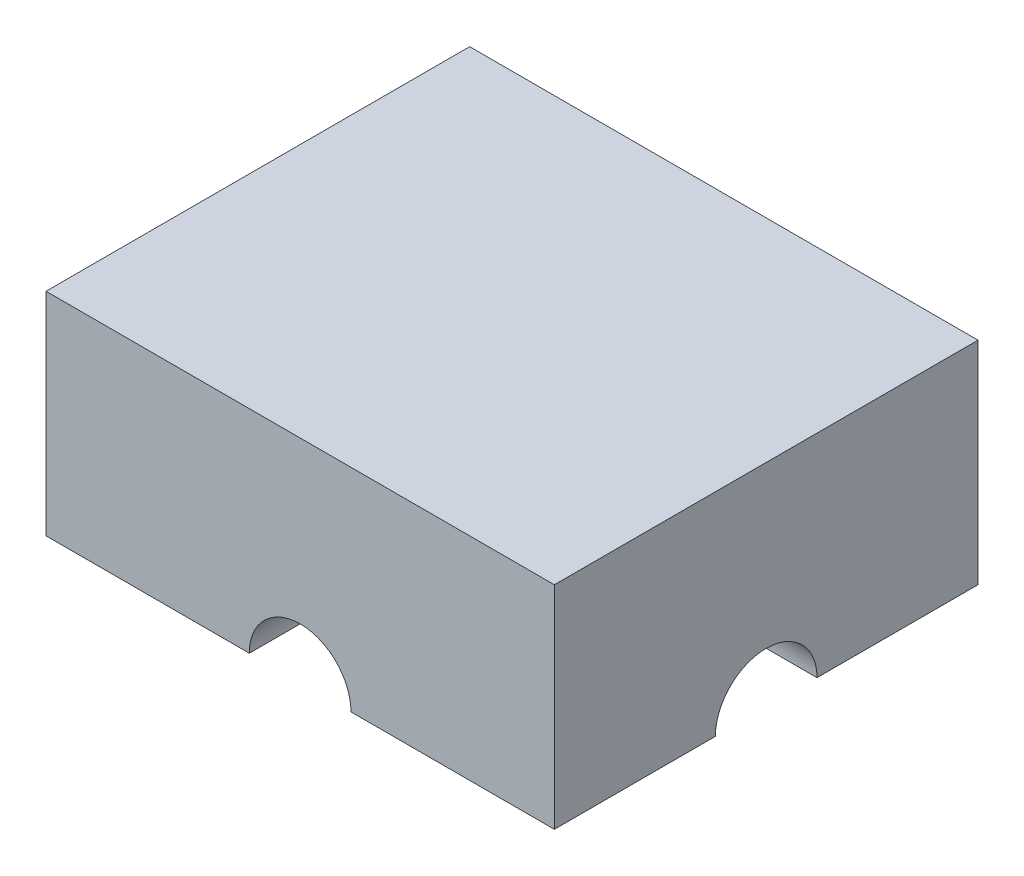
ISO-10303-21;
HEADER;
FILE_DESCRIPTION(('STEP AP214'),'2;1');
FILE_NAME('part.step','',(''),(''),'','','');
FILE_SCHEMA(('AUTOMOTIVE_DESIGN { 1 0 10303 214 1 1 1 1 }'));
ENDSEC;
DATA;
#1=APPLICATION_CONTEXT('core data for automotive mechanical design processes');
#2=APPLICATION_PROTOCOL_DEFINITION('international standard','automotive_design',2000,#1);
#3=PRODUCT_CONTEXT('',#1,'mechanical');
#4=PRODUCT('Part','Part','',(#3));
#5=PRODUCT_RELATED_PRODUCT_CATEGORY('part','',(#4));
#6=PRODUCT_DEFINITION_FORMATION('','',#4);
#7=PRODUCT_DEFINITION_CONTEXT('part definition',#1,'design');
#8=PRODUCT_DEFINITION('design','',#6,#7);
#9=PRODUCT_DEFINITION_SHAPE('','',#8);
#10=(LENGTH_UNIT() NAMED_UNIT(*) SI_UNIT(.MILLI.,.METRE.));
#11=(NAMED_UNIT(*) PLANE_ANGLE_UNIT() SI_UNIT($,.RADIAN.));
#12=(NAMED_UNIT(*) SI_UNIT($,.STERADIAN.) SOLID_ANGLE_UNIT());
#13=UNCERTAINTY_MEASURE_WITH_UNIT(LENGTH_MEASURE(1.E-05),#10,'distance_accuracy_value','');
#14=(GEOMETRIC_REPRESENTATION_CONTEXT(3) GLOBAL_UNCERTAINTY_ASSIGNED_CONTEXT((#13)) GLOBAL_UNIT_ASSIGNED_CONTEXT((#10,
#11,#12)) REPRESENTATION_CONTEXT('',''));
#15=CARTESIAN_POINT('',(0.,0.,0.));
#16=DIRECTION('',(0.,0.,1.));
#17=DIRECTION('',(1.,0.,0.));
#18=AXIS2_PLACEMENT_3D('',#15,#16,#17);
#19=CARTESIAN_POINT('',(-60.,0.,-100.));
#20=DIRECTION('',(0.,-1.,0.));
#21=DIRECTION('',(1.,0.,0.));
#22=AXIS2_PLACEMENT_3D('',#19,#20,#21);
#23=PLANE('',#22);
#24=DIRECTION('',(0.,0.,1.));
#25=VECTOR('',#24,1.);
#26=CARTESIAN_POINT('',(12.,0.,-50.));
#27=LINE('',#26,#25);
#28=CARTESIAN_POINT('',(12.,0.,-35.));
#29=VERTEX_POINT('',#28);
#30=CARTESIAN_POINT('',(12.,0.,0.));
#31=VERTEX_POINT('',#30);
#32=EDGE_CURVE('E233',#29,#31,#27,.T.);
#33=ORIENTED_EDGE('',*,*,#32,.F.);
#34=CARTESIAN_POINT('',(15.,0.,-35.));
#35=DIRECTION('',(0.,-1.,0.));
#36=DIRECTION('',(1.,0.,0.));
#37=AXIS2_PLACEMENT_3D('',#34,#35,#36);
#38=CIRCLE('',#37,3.);
#39=CARTESIAN_POINT('',(15.,0.,-38.));
#40=VERTEX_POINT('',#39);
#41=EDGE_CURVE('E73',#29,#40,#38,.T.);
#42=ORIENTED_EDGE('',*,*,#41,.T.);
#43=DIRECTION('',(-1.,0.,0.));
#44=VECTOR('',#43,1.);
#45=CARTESIAN_POINT('',(60.,0.,-38.));
#46=LINE('',#45,#44);
#47=CARTESIAN_POINT('',(60.,0.,-38.));
#48=VERTEX_POINT('',#47);
#49=EDGE_CURVE('E124',#48,#40,#46,.T.);
#50=ORIENTED_EDGE('',*,*,#49,.F.);
#51=DIRECTION('',(0.,0.,1.));
#52=VECTOR('',#51,1.);
#53=CARTESIAN_POINT('',(60.,0.,-100.));
#54=LINE('',#53,#52);
#55=CARTESIAN_POINT('',(60.,0.,0.));
#56=VERTEX_POINT('',#55);
#57=EDGE_CURVE('E136',#48,#56,#54,.T.);
#58=ORIENTED_EDGE('',*,*,#57,.T.);
#59=DIRECTION('',(1.,0.,0.));
#60=VECTOR('',#59,1.);
#61=CARTESIAN_POINT('',(-60.,0.,0.));
#62=LINE('',#61,#60);
#63=EDGE_CURVE('E246',#31,#56,#62,.T.);
#64=ORIENTED_EDGE('',*,*,#63,.F.);
#65=EDGE_LOOP('',(#33,#42,#50,#58,#64));
#66=FACE_BOUND('',#65,.T.);
#67=ADVANCED_FACE('F43',(#66),#23,.T.);
#68=CARTESIAN_POINT('',(-15.,0.,-38.));
#69=VERTEX_POINT('',#68);
#70=CARTESIAN_POINT('',(-60.,0.,-38.));
#71=VERTEX_POINT('',#70);
#72=EDGE_CURVE('E132',#69,#71,#46,.T.);
#73=ORIENTED_EDGE('',*,*,#72,.F.);
#74=CARTESIAN_POINT('',(-15.,0.,-35.));
#75=DIRECTION('',(0.,-1.,0.));
#76=DIRECTION('',(1.,0.,0.));
#77=AXIS2_PLACEMENT_3D('',#74,#75,#76);
#78=CIRCLE('',#77,3.);
#79=CARTESIAN_POINT('',(-12.,0.,-35.));
#80=VERTEX_POINT('',#79);
#81=EDGE_CURVE('E11',#69,#80,#78,.T.);
#82=ORIENTED_EDGE('',*,*,#81,.T.);
#83=DIRECTION('',(0.,0.,1.));
#84=VECTOR('',#83,1.);
#85=CARTESIAN_POINT('',(-12.,0.,-50.));
#86=LINE('',#85,#84);
#87=CARTESIAN_POINT('',(-12.,0.,0.));
#88=VERTEX_POINT('',#87);
#89=EDGE_CURVE('E361',#88,#80,#86,.F.);
#90=ORIENTED_EDGE('',*,*,#89,.F.);
#91=CARTESIAN_POINT('',(-60.,0.,0.));
#92=VERTEX_POINT('',#91);
#93=EDGE_CURVE('E247',#92,#88,#62,.T.);
#94=ORIENTED_EDGE('',*,*,#93,.F.);
#95=DIRECTION('',(0.,0.,1.));
#96=VECTOR('',#95,1.);
#97=CARTESIAN_POINT('',(-60.,0.,-100.));
#98=LINE('',#97,#96);
#99=EDGE_CURVE('E152',#71,#92,#98,.T.);
#100=ORIENTED_EDGE('',*,*,#99,.F.);
#101=EDGE_LOOP('',(#73,#82,#90,#94,#100));
#102=FACE_BOUND('',#101,.T.);
#103=ADVANCED_FACE('F192',(#102),#23,.T.);
#104=CARTESIAN_POINT('',(-60.,0.,-100.));
#105=DIRECTION('',(-1.,0.,0.));
#106=DIRECTION('',(0.,0.,1.));
#107=AXIS2_PLACEMENT_3D('',#104,#105,#106);
#108=PLANE('',#107);
#109=CARTESIAN_POINT('',(-60.,0.,-50.));
#110=DIRECTION('',(-1.,0.,0.));
#111=DIRECTION('',(0.,0.,1.));
#112=AXIS2_PLACEMENT_3D('',#109,#110,#111);
#113=CIRCLE('',#112,12.);
#114=CARTESIAN_POINT('',(-60.,0.,-62.));
#115=VERTEX_POINT('',#114);
#116=EDGE_CURVE('E133',#71,#115,#113,.T.);
#117=ORIENTED_EDGE('',*,*,#116,.F.);
#118=ORIENTED_EDGE('',*,*,#99,.T.);
#119=DIRECTION('',(0.,-1.,0.));
#120=VECTOR('',#119,1.);
#121=CARTESIAN_POINT('',(-60.,0.,0.));
#122=LINE('',#121,#120);
#123=CARTESIAN_POINT('',(-60.,50.,0.));
#124=VERTEX_POINT('',#123);
#125=EDGE_CURVE('E242',#124,#92,#122,.T.);
#126=ORIENTED_EDGE('',*,*,#125,.F.);
#127=DIRECTION('',(0.,0.,1.));
#128=VECTOR('',#127,1.);
#129=CARTESIAN_POINT('',(-60.,50.,-100.));
#130=LINE('',#129,#128);
#131=CARTESIAN_POINT('',(-60.,50.,-100.));
#132=VERTEX_POINT('',#131);
#133=EDGE_CURVE('E162',#132,#124,#130,.T.);
#134=ORIENTED_EDGE('',*,*,#133,.F.);
#135=DIRECTION('',(0.,-1.,0.));
#136=VECTOR('',#135,1.);
#137=CARTESIAN_POINT('',(-60.,0.,-100.));
#138=LINE('',#137,#136);
#139=CARTESIAN_POINT('',(-60.,0.,-100.));
#140=VERTEX_POINT('',#139);
#141=EDGE_CURVE('E218',#132,#140,#138,.T.);
#142=ORIENTED_EDGE('',*,*,#141,.T.);
#143=EDGE_CURVE('E146',#140,#115,#98,.T.);
#144=ORIENTED_EDGE('',*,*,#143,.T.);
#145=EDGE_LOOP('',(#117,#118,#126,#134,#142,#144));
#146=FACE_BOUND('',#145,.T.);
#147=ADVANCED_FACE('F178',(#146),#108,.T.);
#148=CARTESIAN_POINT('',(-60.,50.,-100.));
#149=DIRECTION('',(0.,1.,0.));
#150=DIRECTION('',(-1.,0.,0.));
#151=AXIS2_PLACEMENT_3D('',#148,#149,#150);
#152=PLANE('',#151);
#153=DIRECTION('',(-1.,0.,0.));
#154=VECTOR('',#153,1.);
#155=CARTESIAN_POINT('',(-60.,50.,0.));
#156=LINE('',#155,#154);
#157=CARTESIAN_POINT('',(60.,50.,0.));
#158=VERTEX_POINT('',#157);
#159=EDGE_CURVE('E224',#158,#124,#156,.T.);
#160=ORIENTED_EDGE('',*,*,#159,.F.);
#161=DIRECTION('',(0.,0.,1.));
#162=VECTOR('',#161,1.);
#163=CARTESIAN_POINT('',(60.,50.,-100.));
#164=LINE('',#163,#162);
#165=CARTESIAN_POINT('',(60.,50.,-100.));
#166=VERTEX_POINT('',#165);
#167=EDGE_CURVE('E150',#166,#158,#164,.T.);
#168=ORIENTED_EDGE('',*,*,#167,.F.);
#169=DIRECTION('',(-1.,0.,0.));
#170=VECTOR('',#169,1.);
#171=CARTESIAN_POINT('',(-60.,50.,-100.));
#172=LINE('',#171,#170);
#173=EDGE_CURVE('E239',#166,#132,#172,.T.);
#174=ORIENTED_EDGE('',*,*,#173,.T.);
#175=ORIENTED_EDGE('',*,*,#133,.T.);
#176=EDGE_LOOP('',(#160,#168,#174,#175));
#177=FACE_BOUND('',#176,.T.);
#178=ADVANCED_FACE('F207',(#177),#152,.T.);
#179=CARTESIAN_POINT('',(60.,0.,-100.));
#180=DIRECTION('',(1.,0.,0.));
#181=DIRECTION('',(0.,1.,0.));
#182=AXIS2_PLACEMENT_3D('',#179,#180,#181);
#183=PLANE('',#182);
#184=CARTESIAN_POINT('',(60.,0.,-50.));
#185=DIRECTION('',(-1.,0.,0.));
#186=DIRECTION('',(0.,0.,1.));
#187=AXIS2_PLACEMENT_3D('',#184,#185,#186);
#188=CIRCLE('',#187,12.);
#189=CARTESIAN_POINT('',(60.,0.,-62.));
#190=VERTEX_POINT('',#189);
#191=EDGE_CURVE('E122',#48,#190,#188,.T.);
#192=ORIENTED_EDGE('',*,*,#191,.T.);
#193=CARTESIAN_POINT('',(60.,0.,-100.));
#194=VERTEX_POINT('',#193);
#195=EDGE_CURVE('E145',#194,#190,#54,.T.);
#196=ORIENTED_EDGE('',*,*,#195,.F.);
#197=DIRECTION('',(0.,1.,0.));
#198=VECTOR('',#197,1.);
#199=CARTESIAN_POINT('',(60.,0.,-100.));
#200=LINE('',#199,#198);
#201=EDGE_CURVE('E228',#194,#166,#200,.T.);
#202=ORIENTED_EDGE('',*,*,#201,.T.);
#203=ORIENTED_EDGE('',*,*,#167,.T.);
#204=DIRECTION('',(0.,1.,0.));
#205=VECTOR('',#204,1.);
#206=CARTESIAN_POINT('',(60.,0.,0.));
#207=LINE('',#206,#205);
#208=EDGE_CURVE('E143',#56,#158,#207,.T.);
#209=ORIENTED_EDGE('',*,*,#208,.F.);
#210=ORIENTED_EDGE('',*,*,#57,.F.);
#211=EDGE_LOOP('',(#192,#196,#202,#203,#209,#210));
#212=FACE_BOUND('',#211,.T.);
#213=ADVANCED_FACE('F141',(#212),#183,.T.);
#214=DIRECTION('',(-1.,0.,0.));
#215=VECTOR('',#214,1.);
#216=CARTESIAN_POINT('',(60.,0.,-62.));
#217=LINE('',#216,#215);
#218=EDGE_CURVE('E127',#115,#190,#217,.F.);
#219=ORIENTED_EDGE('',*,*,#218,.F.);
#220=ORIENTED_EDGE('',*,*,#143,.F.);
#221=DIRECTION('',(1.,0.,0.));
#222=VECTOR('',#221,1.);
#223=CARTESIAN_POINT('',(-60.,0.,-100.));
#224=LINE('',#223,#222);
#225=EDGE_CURVE('E223',#140,#194,#224,.T.);
#226=ORIENTED_EDGE('',*,*,#225,.T.);
#227=ORIENTED_EDGE('',*,*,#195,.T.);
#228=EDGE_LOOP('',(#219,#220,#226,#227));
#229=FACE_BOUND('',#228,.T.);
#230=ADVANCED_FACE('F193',(#229),#23,.T.);
#231=CARTESIAN_POINT('',(0.,0.,-100.));
#232=DIRECTION('',(0.,0.,-1.));
#233=DIRECTION('',(-1.,0.,0.));
#234=AXIS2_PLACEMENT_3D('',#231,#232,#233);
#235=PLANE('',#234);
#236=ORIENTED_EDGE('',*,*,#141,.F.);
#237=ORIENTED_EDGE('',*,*,#173,.F.);
#238=ORIENTED_EDGE('',*,*,#201,.F.);
#239=ORIENTED_EDGE('',*,*,#225,.F.);
#240=EDGE_LOOP('',(#236,#237,#238,#239));
#241=FACE_BOUND('',#240,.T.);
#242=ADVANCED_FACE('F200',(#241),#235,.T.);
#243=CARTESIAN_POINT('',(0.,0.,0.));
#244=DIRECTION('',(0.,0.,-1.));
#245=DIRECTION('',(-1.,0.,0.));
#246=AXIS2_PLACEMENT_3D('',#243,#244,#245);
#247=PLANE('',#246);
#248=ORIENTED_EDGE('',*,*,#93,.T.);
#249=CARTESIAN_POINT('',(0.,0.,0.));
#250=DIRECTION('',(0.,0.,1.));
#251=DIRECTION('',(1.,0.,0.));
#252=AXIS2_PLACEMENT_3D('',#249,#250,#251);
#253=CIRCLE('',#252,12.);
#254=EDGE_CURVE('E211',#31,#88,#253,.T.);
#255=ORIENTED_EDGE('',*,*,#254,.F.);
#256=ORIENTED_EDGE('',*,*,#63,.T.);
#257=ORIENTED_EDGE('',*,*,#208,.T.);
#258=ORIENTED_EDGE('',*,*,#159,.T.);
#259=ORIENTED_EDGE('',*,*,#125,.T.);
#260=EDGE_LOOP('',(#248,#255,#256,#257,#258,#259));
#261=FACE_BOUND('',#260,.T.);
#262=ADVANCED_FACE('F189',(#261),#247,.F.);
#263=CARTESIAN_POINT('',(0.,0.,-50.));
#264=DIRECTION('',(0.,0.,1.));
#265=DIRECTION('',(1.,0.,0.));
#266=AXIS2_PLACEMENT_3D('',#263,#264,#265);
#267=CYLINDRICAL_SURFACE('',#266,12.);
#268=CARTESIAN_POINT('',(0.,0.,-50.));
#269=DIRECTION('',(-0.78086880944303,0.,-0.624695047554424));
#270=DIRECTION('',(-0.624695047554424,0.,0.78086880944303));
#271=AXIS2_PLACEMENT_3D('',#268,#269,#270);
#272=ELLIPSE('',#271,19.2093727122985,12.);
#273=CARTESIAN_POINT('',(0.,12.,-50.));
#274=VERTEX_POINT('',#273);
#275=EDGE_CURVE('E157',#80,#274,#272,.T.);
#276=ORIENTED_EDGE('',*,*,#275,.T.);
#277=CARTESIAN_POINT('',(0.,0.,-50.));
#278=DIRECTION('',(0.78086880944303,0.,-0.624695047554424));
#279=DIRECTION('',(0.624695047554424,0.,0.78086880944303));
#280=AXIS2_PLACEMENT_3D('',#277,#278,#279);
#281=ELLIPSE('',#280,19.2093727122985,12.);
#282=EDGE_CURVE('E161',#274,#29,#281,.T.);
#283=ORIENTED_EDGE('',*,*,#282,.T.);
#284=ORIENTED_EDGE('',*,*,#32,.T.);
#285=ORIENTED_EDGE('',*,*,#254,.T.);
#286=ORIENTED_EDGE('',*,*,#89,.T.);
#287=EDGE_LOOP('',(#276,#283,#284,#285,#286));
#288=FACE_BOUND('',#287,.T.);
#289=ADVANCED_FACE('F180',(#288),#267,.F.);
#290=CARTESIAN_POINT('',(60.,0.,-50.));
#291=DIRECTION('',(-1.,0.,0.));
#292=DIRECTION('',(0.,0.,1.));
#293=AXIS2_PLACEMENT_3D('',#290,#291,#292);
#294=CYLINDRICAL_SURFACE('',#293,12.);
#295=ORIENTED_EDGE('',*,*,#49,.T.);
#296=CARTESIAN_POINT('',(0.,0.,-50.));
#297=DIRECTION('',(0.624695047554424,0.,-0.78086880944303));
#298=DIRECTION('',(0.78086880944303,0.,0.624695047554424));
#299=AXIS2_PLACEMENT_3D('',#296,#297,#298);
#300=ELLIPSE('',#299,19.2093727122985,12.);
#301=EDGE_CURVE('E57',#40,#274,#300,.F.);
#302=ORIENTED_EDGE('',*,*,#301,.T.);
#303=CARTESIAN_POINT('',(0.,0.,-50.));
#304=DIRECTION('',(-0.624695047554424,0.,-0.78086880944303));
#305=DIRECTION('',(-0.78086880944303,0.,0.624695047554424));
#306=AXIS2_PLACEMENT_3D('',#303,#304,#305);
#307=ELLIPSE('',#306,19.2093727122985,12.);
#308=EDGE_CURVE('E65',#274,#69,#307,.F.);
#309=ORIENTED_EDGE('',*,*,#308,.T.);
#310=ORIENTED_EDGE('',*,*,#72,.T.);
#311=ORIENTED_EDGE('',*,*,#116,.T.);
#312=ORIENTED_EDGE('',*,*,#218,.T.);
#313=ORIENTED_EDGE('',*,*,#191,.F.);
#314=EDGE_LOOP('',(#295,#302,#309,#310,#311,#312,#313));
#315=FACE_BOUND('',#314,.T.);
#316=ADVANCED_FACE('F123',(#315),#294,.F.);
#317=CARTESIAN_POINT('',(0.,-12.,-50.));
#318=CARTESIAN_POINT('',(0.,-12.,-50.));
#319=CARTESIAN_POINT('',(0.,-12.,-50.));
#320=CARTESIAN_POINT('',(0.2614408472061,-11.9999849249477,-49.6731989409926));
#321=CARTESIAN_POINT('',(0.294120703844806,-12.0000244476768,-49.7058792961554));
#322=CARTESIAN_POINT('',(0.326801059007659,-11.9999849249477,-49.7385591527941));
#323=CARTESIAN_POINT('',(0.522843973099758,-11.9914563135489,-49.3464450336255));
#324=CARTESIAN_POINT('',(0.588407839201711,-11.9893107825415,-49.4115921607985));
#325=CARTESIAN_POINT('',(0.653554966374736,-11.9914563135489,-49.4771560269004));
#326=CARTESIAN_POINT('',(1.04511074829693,-11.9572705421025,-48.693611564629));
#327=CARTESIAN_POINT('',(1.17554027252673,-11.946581071536,-48.8244597274734));
#328=CARTESIAN_POINT('',(1.30638843537119,-11.9572705421025,-48.9548892517032));
#329=CARTESIAN_POINT('',(1.30597435077628,-11.9316119531933,-48.3675320615297));
#330=CARTESIAN_POINT('',(1.46880200249894,-11.9145023759656,-48.5311979975011));
#331=CARTESIAN_POINT('',(1.63246793847036,-11.9316119531933,-48.6940256492238));
#332=CARTESIAN_POINT('',(2.08240811619031,-11.829394860983,-47.396989854762));
#333=CARTESIAN_POINT('',(2.3409925564402,-11.7867369846117,-47.6590074435597));
#334=CARTESIAN_POINT('',(2.60301014523787,-11.829394860983,-47.9175918838096));
#335=CARTESIAN_POINT('',(2.59644407464452,-11.727595644062,-46.7544449066943));
#336=CARTESIAN_POINT('',(2.91752305161676,-11.6591112578583,-47.0824769483832));
#337=CARTESIAN_POINT('',(3.24555509330565,-11.727595644062,-47.4035559253554));
#338=CARTESIAN_POINT('',(3.60666912537568,-11.4569134557803,-45.4916635932804));
#339=CARTESIAN_POINT('',(4.04051458488435,-11.3232152482514,-45.9594854151157));
#340=CARTESIAN_POINT('',(4.5083364067196,-11.4569134557803,-46.3933308746243));
#341=CARTESIAN_POINT('',(4.1030129475613,-11.2891843165524,-44.8712338155484));
#342=CARTESIAN_POINT('',(4.59026929191549,-11.1144635639205,-45.4097307080845));
#343=CARTESIAN_POINT('',(5.12876618445163,-11.2891843165524,-45.8969870524387));
#344=CARTESIAN_POINT('',(5.06933857340242,-10.8889161291346,-43.663326783247));
#345=CARTESIAN_POINT('',(5.6470823277106,-10.6227239154056,-44.3529176722894));
#346=CARTESIAN_POINT('',(6.33667321675301,-10.8889161291346,-44.9306614265976));
#347=CARTESIAN_POINT('',(5.53966858148872,-10.6580754207604,-43.0754142731391));
#348=CARTESIAN_POINT('',(6.15732656150743,-10.3390308604496,-43.8426734384926));
#349=CARTESIAN_POINT('',(6.92458572686087,-10.6580754207604,-44.4603314185113));
#350=CARTESIAN_POINT('',(6.44567903937127,-10.1349937648511,-41.9429012007859));
#351=CARTESIAN_POINT('',(7.12318265023234,-9.70667913430943,-42.8768173497677));
#352=CARTESIAN_POINT('',(8.05709879921412,-10.1349937648511,-43.5543209606287));
#353=CARTESIAN_POINT('',(6.88198587058532,-9.84494106791221,-41.3975176617682));
#354=CARTESIAN_POINT('',(7.58178312961681,-9.35713927731977,-42.4182168703832));
#355=CARTESIAN_POINT('',(8.60248233823176,-9.8449410679122,-43.1180141294147));
#356=CARTESIAN_POINT('',(7.71221141467886,-9.20787563581431,-40.3597357316515));
#357=CARTESIAN_POINT('',(8.43391634977841,-8.60555001942632,-41.5660836502216));
#358=CARTESIAN_POINT('',(9.64026426834846,-9.2078756358143,-42.2877885853211));
#359=CARTESIAN_POINT('',(8.10711078926632,-8.86344570709315,-39.8661115134175));
#360=CARTESIAN_POINT('',(8.83011490699724,-8.2025493639513,-41.1698850930028));
#361=CARTESIAN_POINT('',(10.1338884865825,-8.86344570709314,-41.8928892107337));
#362=CARTESIAN_POINT('',(8.84734109065726,-8.12322764358409,-38.940823636678));
#363=CARTESIAN_POINT('',(9.5494592843219,-7.35989369823599,-40.4505407156781));
#364=CARTESIAN_POINT('',(11.059176363322,-8.12322764358408,-41.1526589093427));
#365=CARTESIAN_POINT('',(9.19406701949866,-7.73025259710658,-38.5074162256252));
#366=CARTESIAN_POINT('',(9.87479419610363,-6.919418395037,-40.1252058038964));
#367=CARTESIAN_POINT('',(11.4925837743748,-7.73025259710657,-40.8059329805014));
#368=CARTESIAN_POINT('',(9.83175230360238,-6.89912981047186,-37.7103096204984));
#369=CARTESIAN_POINT('',(10.4483933533396,-6.02035341775239,-39.5516066466604));
#370=CARTESIAN_POINT('',(12.2896903795016,-6.89912981047185,-40.1682476963976));
#371=CARTESIAN_POINT('',(10.1245177578305,-6.46380643315628,-37.344352802717));
#372=CARTESIAN_POINT('',(10.6982372651991,-5.56137314457481,-39.3017627348009));
#373=CARTESIAN_POINT('',(12.655647197283,-6.46380643315627,-39.8754822421696));
#374=CARTESIAN_POINT('',(10.5204094645842,-5.77812318351563,-36.8494881692674));
#375=CARTESIAN_POINT('',(11.016495676045,-4.8742056778976,-38.9835043239551));
#376=CARTESIAN_POINT('',(13.1505118307326,-5.77812318351563,-39.4795905354159));
#377=CARTESIAN_POINT('',(10.6427977924614,-5.54972802872553,-36.6965027594164));
#378=CARTESIAN_POINT('',(11.1123741959383,-4.64791300638534,-38.8876258040617));
#379=CARTESIAN_POINT('',(13.3034972405836,-5.54972802872553,-39.3572022075386));
#380=CARTESIAN_POINT('',(10.8747063070301,-5.08027749291625,-36.4066171162078));
#381=CARTESIAN_POINT('',(11.2886359882688,-4.19296807469157,-38.7113640117312));
#382=CARTESIAN_POINT('',(13.5933828837922,-5.08027749291625,-39.1252936929699));
#383=CARTESIAN_POINT('',(10.9842321909222,-4.83922778599962,-36.2697097613492));
#384=CARTESIAN_POINT('',(11.3687268185966,-3.96446758489027,-38.6312731814034));
#385=CARTESIAN_POINT('',(13.7302902386508,-4.83922778599962,-39.0157678090778));
#386=CARTESIAN_POINT('',(11.1849064272088,-4.35475936955882,-36.0188669659871));
#387=CARTESIAN_POINT('',(11.5106262600249,-3.51628822386966,-38.4893737399751));
#388=CARTESIAN_POINT('',(13.9811330340129,-4.35475936955881,-38.8150935727912));
#389=CARTESIAN_POINT('',(11.2766029490495,-4.11179547573129,-35.9042463136765));
#390=CARTESIAN_POINT('',(11.5727809234718,-3.29676010454903,-38.4272190765282));
#391=CARTESIAN_POINT('',(14.0957536863235,-4.11179547573128,-38.7233970509505));
#392=CARTESIAN_POINT('',(11.4452416573039,-3.61593237423821,-35.6934479283582));
#393=CARTESIAN_POINT('',(11.6833387362449,-2.85936131895651,-38.3166612637551));
#394=CARTESIAN_POINT('',(14.3065520716418,-3.61593237423821,-38.5547583426961));
#395=CARTESIAN_POINT('',(11.5221909757732,-3.36303804080601,-35.597261280281));
#396=CARTESIAN_POINT('',(11.7314913218485,-2.64186477164498,-38.2685086781515));
#397=CARTESIAN_POINT('',(14.402738719719,-3.36303804080601,-38.4778090242268));
#398=CARTESIAN_POINT('',(11.6579847991343,-2.8562475778874,-35.4275190010845));
#399=CARTESIAN_POINT('',(11.8137662877979,-2.21609591435455,-38.1862337122021));
#400=CARTESIAN_POINT('',(14.5724809989155,-2.85624757788739,-38.3420152008657));
#401=CARTESIAN_POINT('',(11.7172985836184,-2.60260361825069,-35.3533767704753));
#402=CARTESIAN_POINT('',(11.8480688981399,-2.008124677598,-38.1519311018601));
#403=CARTESIAN_POINT('',(14.6466232295248,-2.60260361825068,-38.2827014163816));
#404=CARTESIAN_POINT('',(11.8197031265459,-2.08883011753937,-35.2253710918143));
#405=CARTESIAN_POINT('',(11.9057331830565,-1.59511938281633,-38.0942668169436));
#406=CARTESIAN_POINT('',(14.7746289081857,-2.08883011753937,-38.1802968734541));
#407=CARTESIAN_POINT('',(11.8627946119897,-1.82870086765943,-35.1715067350121));
#408=CARTESIAN_POINT('',(11.9289381513952,-1.39059855789788,-38.0710618486048));
#409=CARTESIAN_POINT('',(14.8284932649879,-1.82870086765943,-38.1372053880103));
#410=CARTESIAN_POINT('',(11.9313186885834,-1.3082069988968,-35.0858516392715));
#411=CARTESIAN_POINT('',(11.9651916027638,-0.987304599299415,-38.0348083972362));
#412=CARTESIAN_POINT('',(14.9141483607285,-1.3082069988968,-38.0686813114166));
#413=CARTESIAN_POINT('',(11.9570278164503,-1.04791540842652,-35.0537152294368));
#414=CARTESIAN_POINT('',(11.9783003866081,-0.789013726697772,-38.0216996133919));
#415=CARTESIAN_POINT('',(14.9462847705632,-1.04791540842652,-38.0429721835498));
#416=CARTESIAN_POINT('',(11.9913683202831,-0.525082518572464,-35.0107895996454));
#417=CARTESIAN_POINT('',(11.9957292939071,-0.39353660627546,-38.004270706093));
#418=CARTESIAN_POINT('',(14.9892104003546,-0.525082518572463,-38.0086316797169));
#419=CARTESIAN_POINT('',(12.,-0.26254125928623,-35.));
#420=CARTESIAN_POINT('',(12.,-0.19691014621663,-38.));
#421=CARTESIAN_POINT('',(15.,-0.262541259286229,-38.));
#422=CARTESIAN_POINT('',(12.,0.262541259286237,-35.));
#423=CARTESIAN_POINT('',(12.,0.196910146216639,-38.));
#424=CARTESIAN_POINT('',(15.,0.262541259286239,-38.));
#425=CARTESIAN_POINT('',(11.9913683202831,0.525082518572471,-35.0107895996454));
#426=CARTESIAN_POINT('',(11.9957292939071,0.393536606275469,-38.004270706093));
#427=CARTESIAN_POINT('',(14.9892104003546,0.525082518572473,-38.0086316797169));
#428=CARTESIAN_POINT('',(11.9570278164503,1.04791540842653,-35.0537152294368));
#429=CARTESIAN_POINT('',(11.9783003866081,0.789013726697781,-38.0216996133919));
#430=CARTESIAN_POINT('',(14.9462847705632,1.04791540842653,-38.0429721835498));
#431=CARTESIAN_POINT('',(11.9313186885834,1.30820699889681,-35.0858516392715));
#432=CARTESIAN_POINT('',(11.9651916027638,0.987304599299424,-38.0348083972362));
#433=CARTESIAN_POINT('',(14.9141483607285,1.30820699889681,-38.0686813114166));
#434=CARTESIAN_POINT('',(11.8627946119897,1.82870086765943,-35.1715067350121));
#435=CARTESIAN_POINT('',(11.9289381513952,1.39059855789789,-38.0710618486048));
#436=CARTESIAN_POINT('',(14.8284932649879,1.82870086765943,-38.1372053880103));
#437=CARTESIAN_POINT('',(11.8197031265459,2.08883011753937,-35.2253710918143));
#438=CARTESIAN_POINT('',(11.9057331830564,1.59511938281633,-38.0942668169436));
#439=CARTESIAN_POINT('',(14.7746289081857,2.08883011753937,-38.1802968734541));
#440=CARTESIAN_POINT('',(11.7172985836184,2.60260361825068,-35.3533767704753));
#441=CARTESIAN_POINT('',(11.8480688981399,2.008124677598,-38.1519311018601));
#442=CARTESIAN_POINT('',(14.6466232295248,2.60260361825068,-38.2827014163816));
#443=CARTESIAN_POINT('',(11.6579847991343,2.85624757788739,-35.4275190010845));
#444=CARTESIAN_POINT('',(11.8137662877979,2.21609591435455,-38.1862337122021));
#445=CARTESIAN_POINT('',(14.5724809989155,2.8562475778874,-38.3420152008657));
#446=CARTESIAN_POINT('',(11.5221909757732,3.36303804080601,-35.597261280281));
#447=CARTESIAN_POINT('',(11.7314913218485,2.64186477164498,-38.2685086781515));
#448=CARTESIAN_POINT('',(14.402738719719,3.36303804080601,-38.4778090242268));
#449=CARTESIAN_POINT('',(11.4452416573039,3.61593237423821,-35.6934479283582));
#450=CARTESIAN_POINT('',(11.6833387362449,2.85936131895651,-38.3166612637551));
#451=CARTESIAN_POINT('',(14.3065520716418,3.61593237423821,-38.5547583426961));
#452=CARTESIAN_POINT('',(11.2766029490495,4.11179547573129,-35.9042463136765));
#453=CARTESIAN_POINT('',(11.5727809234718,3.29676010454904,-38.4272190765282));
#454=CARTESIAN_POINT('',(14.0957536863235,4.11179547573129,-38.7233970509505));
#455=CARTESIAN_POINT('',(11.1849064272088,4.35475936955882,-36.0188669659871));
#456=CARTESIAN_POINT('',(11.5106262600249,3.51628822386966,-38.4893737399751));
#457=CARTESIAN_POINT('',(13.9811330340129,4.35475936955882,-38.8150935727912));
#458=CARTESIAN_POINT('',(10.9842321909222,4.83922778599963,-36.2697097613492));
#459=CARTESIAN_POINT('',(11.3687268185966,3.96446758489027,-38.6312731814034));
#460=CARTESIAN_POINT('',(13.7302902386508,4.83922778599963,-39.0157678090778));
#461=CARTESIAN_POINT('',(10.8747063070301,5.08027749291625,-36.4066171162078));
#462=CARTESIAN_POINT('',(11.2886359882688,4.19296807469157,-38.7113640117312));
#463=CARTESIAN_POINT('',(13.5933828837922,5.08027749291625,-39.1252936929699));
#464=CARTESIAN_POINT('',(10.6427977924614,5.54972802872553,-36.6965027594164));
#465=CARTESIAN_POINT('',(11.1123741959383,4.64791300638534,-38.8876258040617));
#466=CARTESIAN_POINT('',(13.3034972405836,5.54972802872554,-39.3572022075386));
#467=CARTESIAN_POINT('',(10.5204094645842,5.77812318351563,-36.8494881692674));
#468=CARTESIAN_POINT('',(11.016495676045,4.87420567789761,-38.983504323955));
#469=CARTESIAN_POINT('',(13.1505118307326,5.77812318351563,-39.4795905354158));
#470=CARTESIAN_POINT('',(10.1245177578305,6.46380643315628,-37.344352802717));
#471=CARTESIAN_POINT('',(10.6982372651991,5.56137314457482,-39.3017627348009));
#472=CARTESIAN_POINT('',(12.655647197283,6.46380643315628,-39.8754822421695));
#473=CARTESIAN_POINT('',(9.83175230360238,6.89912981047186,-37.7103096204984));
#474=CARTESIAN_POINT('',(10.4483933533396,6.0203534177524,-39.5516066466604));
#475=CARTESIAN_POINT('',(12.2896903795016,6.89912981047186,-40.1682476963976));
#476=CARTESIAN_POINT('',(9.19406701949866,7.73025259710658,-38.5074162256252));
#477=CARTESIAN_POINT('',(9.87479419610364,6.91941839503701,-40.1252058038964));
#478=CARTESIAN_POINT('',(11.4925837743748,7.73025259710658,-40.8059329805013));
#479=CARTESIAN_POINT('',(8.84734109065726,8.12322764358409,-38.940823636678));
#480=CARTESIAN_POINT('',(9.5494592843219,7.35989369823599,-40.4505407156781));
#481=CARTESIAN_POINT('',(11.059176363322,8.12322764358409,-41.1526589093427));
#482=CARTESIAN_POINT('',(8.10711078926632,8.86344570709315,-39.8661115134175));
#483=CARTESIAN_POINT('',(8.83011490699725,8.2025493639513,-41.1698850930028));
#484=CARTESIAN_POINT('',(10.1338884865825,8.86344570709315,-41.8928892107337));
#485=CARTESIAN_POINT('',(7.71221141467887,9.2078756358143,-40.3597357316515));
#486=CARTESIAN_POINT('',(8.43391634977842,8.60555001942632,-41.5660836502216));
#487=CARTESIAN_POINT('',(9.64026426834847,9.2078756358143,-42.2877885853211));
#488=CARTESIAN_POINT('',(6.88198587058532,9.84494106791221,-41.3975176617682));
#489=CARTESIAN_POINT('',(7.58178312961682,9.35713927731978,-42.4182168703832));
#490=CARTESIAN_POINT('',(8.60248233823176,9.84494106791221,-43.1180141294147));
#491=CARTESIAN_POINT('',(6.44567903937127,10.1349937648511,-41.9429012007859));
#492=CARTESIAN_POINT('',(7.12318265023234,9.70667913430944,-42.8768173497677));
#493=CARTESIAN_POINT('',(8.05709879921412,10.1349937648511,-43.5543209606287));
#494=CARTESIAN_POINT('',(5.53966858148872,10.6580754207604,-43.0754142731391));
#495=CARTESIAN_POINT('',(6.15732656150744,10.3390308604496,-43.8426734384926));
#496=CARTESIAN_POINT('',(6.92458572686087,10.6580754207604,-44.4603314185113));
#497=CARTESIAN_POINT('',(5.06933857340243,10.8889161291346,-43.663326783247));
#498=CARTESIAN_POINT('',(5.64708232771061,10.6227239154056,-44.3529176722894));
#499=CARTESIAN_POINT('',(6.33667321675303,10.8889161291346,-44.9306614265976));
#500=CARTESIAN_POINT('',(4.1030129475613,11.2891843165524,-44.8712338155484));
#501=CARTESIAN_POINT('',(4.59026929191549,11.1144635639205,-45.4097307080845));
#502=CARTESIAN_POINT('',(5.12876618445163,11.2891843165524,-45.8969870524387));
#503=CARTESIAN_POINT('',(3.60666912537567,11.4569134557803,-45.4916635932804));
#504=CARTESIAN_POINT('',(4.04051458488434,11.3232152482514,-45.9594854151157));
#505=CARTESIAN_POINT('',(4.50833640671959,11.4569134557803,-46.3933308746243));
#506=CARTESIAN_POINT('',(2.59644407464455,11.727595644062,-46.7544449066943));
#507=CARTESIAN_POINT('',(2.91752305161679,11.6591112578583,-47.0824769483832));
#508=CARTESIAN_POINT('',(3.24555509330567,11.727595644062,-47.4035559253555));
#509=CARTESIAN_POINT('',(2.08240811619037,11.829394860983,-47.3969898547621));
#510=CARTESIAN_POINT('',(2.34099255644027,11.7867369846117,-47.6590074435598));
#511=CARTESIAN_POINT('',(2.60301014523795,11.829394860983,-47.9175918838096));
#512=CARTESIAN_POINT('',(1.30597435077625,11.9316119531933,-48.3675320615297));
#513=CARTESIAN_POINT('',(1.4688020024989,11.9145023759656,-48.5311979975011));
#514=CARTESIAN_POINT('',(1.63246793847032,11.9316119531933,-48.6940256492237));
#515=CARTESIAN_POINT('',(1.04511074829684,11.9572705421026,-48.6936115646289));
#516=CARTESIAN_POINT('',(1.17554027252663,11.946581071536,-48.8244597274733));
#517=CARTESIAN_POINT('',(1.30638843537108,11.9572705421026,-48.9548892517031));
#518=CARTESIAN_POINT('',(0.522843973099625,11.9914563135489,-49.3464450336254));
#519=CARTESIAN_POINT('',(0.588407839201561,11.9893107825415,-49.4115921607984));
#520=CARTESIAN_POINT('',(0.653554966374569,11.9914563135489,-49.4771560269003));
#521=CARTESIAN_POINT('',(0.261440847205984,11.9999849249477,-49.6731989409924));
#522=CARTESIAN_POINT('',(0.294120703844676,12.0000244476768,-49.7058792961553));
#523=CARTESIAN_POINT('',(0.326801059007514,11.9999849249477,-49.738559152794));
#524=CARTESIAN_POINT('',(0.,12.,-50.));
#525=CARTESIAN_POINT('',(0.,12.,-50.));
#526=CARTESIAN_POINT('',(0.,12.,-50.));
#527=(BOUNDED_SURFACE() B_SPLINE_SURFACE(3,2,((#317,#318,#319),(#320,#321,#322),(#323,#324,
#325),(#326,#327,#328),(#329,#330,#331),(#332,#333,#334),(#335,#336,#337),(#338,#339,#340),
(#341,#342,#343),(#344,#345,#346),(#347,#348,#349),(#350,#351,#352),(#353,#354,#355),(#356,#357,
#358),(#359,#360,#361),(#362,#363,#364),(#365,#366,#367),(#368,#369,#370),(#371,#372,#373),
(#374,#375,#376),(#377,#378,#379),(#380,#381,#382),(#383,#384,#385),(#386,#387,#388),(#389,#390,
#391),(#392,#393,#394),(#395,#396,#397),(#398,#399,#400),(#401,#402,#403),(#404,#405,#406),
(#407,#408,#409),(#410,#411,#412),(#413,#414,#415),(#416,#417,#418),(#419,#420,#421),(#422,#423,
#424),(#425,#426,#427),(#428,#429,#430),(#431,#432,#433),(#434,#435,#436),(#437,#438,#439),
(#440,#441,#442),(#443,#444,#445),(#446,#447,#448),(#449,#450,#451),(#452,#453,#454),(#455,#456,
#457),(#458,#459,#460),(#461,#462,#463),(#464,#465,#466),(#467,#468,#469),(#470,#471,#472),
(#473,#474,#475),(#476,#477,#478),(#479,#480,#481),(#482,#483,#484),(#485,#486,#487),(#488,#489,
#490),(#491,#492,#493),(#494,#495,#496),(#497,#498,#499),(#500,#501,#502),(#503,#504,#505),
(#506,#507,#508),(#509,#510,#511),(#512,#513,#514),(#515,#516,#517),(#518,#519,#520),(#521,#522,
#523),(#524,#525,#526)),.UNSPECIFIED.,.F.,.F.,.F.) B_SPLINE_SURFACE_WITH_KNOTS((4,2,2,2,2,2,2,2,
2,2,2,2,2,2,2,2,2,2,2,2,2,2,2,2,2,2,2,2,2,2,2,2,2,2,4),(3,3),(0.,1.38624044508175,
2.77259653499542,5.52088691347582,8.22308034270511,10.8587068746997,13.4104412419075,
15.8652262117482,18.2154321383002,20.4600008863153,21.533762983147,22.6070476670444,
23.63868826735,24.6698286786781,25.6703866581676,26.6708997924366,27.6550955928837,
28.6392738876036,29.6234521823235,30.6076479827707,31.6081611170396,32.6087190965292,
33.6398595078573,34.6715001081629,35.7447847920602,36.8185468888919,39.0631156369071,
41.413321563459,43.8681065332998,46.4198409005076,49.0554674325021,51.7576608617314,
54.5059512402118,55.8923073301255,57.2785477752072),(0.,1.),
.UNSPECIFIED.) GEOMETRIC_REPRESENTATION_ITEM() RATIONAL_B_SPLINE_SURFACE(((1.,1.,1.),(1.,
0.999999960865935,1.),(1.,0.99964392274264,1.),(1.,0.998220838485226,1.),(1.,0.997153733038909,
1.),(1.,0.992912441874251,1.),(1.,0.988698134543174,1.),(1.,0.977616683160221,1.),(1.,
0.970795220637255,1.),(1.,0.954789226710293,1.),(1.,0.945667047703301,1.),(1.,0.925487989826963,
1.),(1.,0.914501934744279,1.),(1.,0.891169826601919,1.),(1.,0.878891303129094,1.),(1.,
0.853707619024582,1.),(1.,0.840851439255054,1.),(1.,0.81538526421593,1.),(1.,0.802790177124734,
1.),(1.,0.784723218025256,1.),(1.,0.778962685168039,1.),(1.,0.767759899846262,1.),(1.,
0.762317507007581,1.),(1.,0.752114588403187,1.),(1.,0.747335799236677,1.),(1.,0.738380659152148,
1.),(1.,0.734204017266479,1.),(1.,0.726721604356059,1.),(1.,0.72339367827938,1.),(1.,
0.717585867143039,1.),(1.,0.715105944080684,1.),(1.,0.711136414411883,1.),(1.,0.709631316384635,
1.),(1.,0.707616508624132,1.),(1.,0.707106781186548,1.),(1.,0.707106781186548,1.),(1.,
0.707616508624132,1.),(1.,0.709631316384635,1.),(1.,0.711136414411883,1.),(1.,0.715105944080684,
1.),(1.,0.717585867143039,1.),(1.,0.72339367827938,1.),(1.,0.726721604356059,1.),(1.,
0.734204017266479,1.),(1.,0.738380659152147,1.),(1.,0.747335799236677,1.),(1.,0.752114588403187,
1.),(1.,0.762317507007581,1.),(1.,0.767759899846262,1.),(1.,0.778962685168039,1.),(1.,
0.784723218025256,1.),(1.,0.802790177124734,1.),(1.,0.81538526421593,1.),(1.,0.840851439255054,
1.),(1.,0.853707619024582,1.),(1.,0.878891303129094,1.),(1.,0.891169826601919,1.),(1.,
0.914501934744279,1.),(1.,0.925487989826963,1.),(1.,0.9456670477033,1.),(1.,0.954789226710292,
1.),(1.,0.970795220637255,1.),(1.,0.97761668316022,1.),(1.,0.988698134543174,1.),(1.,
0.992912441874251,1.),(1.,0.997153733038909,1.),(1.,0.998220838485226,1.),(1.,0.999643922742641,
1.),(1.,0.999999960865935,1.),(1.,1.,1.))) REPRESENTATION_ITEM('') SURFACE());
#528=ORIENTED_EDGE('',*,*,#282,.F.);
#529=ORIENTED_EDGE('',*,*,#301,.F.);
#530=ORIENTED_EDGE('',*,*,#41,.F.);
#531=EDGE_LOOP('',(#528,#529,#530));
#532=FACE_BOUND('',#531,.T.);
#533=ADVANCED_FACE('F172',(#532),#527,.T.);
#534=CARTESIAN_POINT('',(0.,12.,-50.));
#535=CARTESIAN_POINT('',(0.,12.,-50.));
#536=CARTESIAN_POINT('',(0.,12.,-50.));
#537=CARTESIAN_POINT('',(-0.261440847205993,11.9999849249477,-49.6731989409924));
#538=CARTESIAN_POINT('',(-0.294120703844685,12.0000244476768,-49.7058792961553));
#539=CARTESIAN_POINT('',(-0.326801059007524,11.9999849249477,-49.738559152794));
#540=CARTESIAN_POINT('',(-0.522843973099636,11.9914563135489,-49.3464450336254));
#541=CARTESIAN_POINT('',(-0.588407839201573,11.9893107825415,-49.4115921607984));
#542=CARTESIAN_POINT('',(-0.653554966374582,11.9914563135489,-49.4771560269003));
#543=CARTESIAN_POINT('',(-1.04511074829685,11.9572705421026,-48.6936115646289));
#544=CARTESIAN_POINT('',(-1.17554027252664,11.946581071536,-48.8244597274733));
#545=CARTESIAN_POINT('',(-1.30638843537109,11.9572705421026,-48.9548892517031));
#546=CARTESIAN_POINT('',(-1.30597435077625,11.9316119531933,-48.3675320615297));
#547=CARTESIAN_POINT('',(-1.4688020024989,11.9145023759656,-48.5311979975011));
#548=CARTESIAN_POINT('',(-1.63246793847032,11.9316119531933,-48.6940256492237));
#549=CARTESIAN_POINT('',(-2.08240811619036,11.829394860983,-47.3969898547621));
#550=CARTESIAN_POINT('',(-2.34099255644026,11.7867369846117,-47.6590074435598));
#551=CARTESIAN_POINT('',(-2.60301014523794,11.829394860983,-47.9175918838097));
#552=CARTESIAN_POINT('',(-2.59644407464454,11.727595644062,-46.7544449066943));
#553=CARTESIAN_POINT('',(-2.91752305161678,11.6591112578583,-47.0824769483832));
#554=CARTESIAN_POINT('',(-3.24555509330566,11.727595644062,-47.4035559253555));
#555=CARTESIAN_POINT('',(-3.60666912537566,11.4569134557803,-45.4916635932804));
#556=CARTESIAN_POINT('',(-4.04051458488433,11.3232152482514,-45.9594854151157));
#557=CARTESIAN_POINT('',(-4.50833640671958,11.4569134557803,-46.3933308746243));
#558=CARTESIAN_POINT('',(-4.10301294756129,11.2891843165524,-44.8712338155484));
#559=CARTESIAN_POINT('',(-4.59026929191548,11.1144635639205,-45.4097307080845));
#560=CARTESIAN_POINT('',(-5.12876618445162,11.2891843165524,-45.8969870524387));
#561=CARTESIAN_POINT('',(-5.06933857340242,10.8889161291346,-43.663326783247));
#562=CARTESIAN_POINT('',(-5.6470823277106,10.6227239154056,-44.3529176722894));
#563=CARTESIAN_POINT('',(-6.33667321675302,10.8889161291346,-44.9306614265976));
#564=CARTESIAN_POINT('',(-5.53966858148872,10.6580754207604,-43.0754142731391));
#565=CARTESIAN_POINT('',(-6.15732656150744,10.3390308604496,-43.8426734384926));
#566=CARTESIAN_POINT('',(-6.92458572686087,10.6580754207604,-44.4603314185113));
#567=CARTESIAN_POINT('',(-6.44567903937127,10.1349937648511,-41.9429012007859));
#568=CARTESIAN_POINT('',(-7.12318265023234,9.70667913430944,-42.8768173497677));
#569=CARTESIAN_POINT('',(-8.05709879921412,10.1349937648511,-43.5543209606287));
#570=CARTESIAN_POINT('',(-6.88198587058531,9.84494106791221,-41.3975176617682));
#571=CARTESIAN_POINT('',(-7.58178312961681,9.35713927731978,-42.4182168703832));
#572=CARTESIAN_POINT('',(-8.60248233823176,9.84494106791221,-43.1180141294147));
#573=CARTESIAN_POINT('',(-7.71221141467886,9.20787563581431,-40.3597357316515));
#574=CARTESIAN_POINT('',(-8.43391634977841,8.60555001942633,-41.5660836502216));
#575=CARTESIAN_POINT('',(-9.64026426834846,9.20787563581431,-42.2877885853211));
#576=CARTESIAN_POINT('',(-8.10711078926631,8.86344570709315,-39.8661115134175));
#577=CARTESIAN_POINT('',(-8.83011490699724,8.20254936395131,-41.1698850930028));
#578=CARTESIAN_POINT('',(-10.1338884865825,8.86344570709315,-41.8928892107337));
#579=CARTESIAN_POINT('',(-8.84734109065726,8.12322764358409,-38.940823636678));
#580=CARTESIAN_POINT('',(-9.5494592843219,7.359893698236,-40.4505407156781));
#581=CARTESIAN_POINT('',(-11.059176363322,8.12322764358409,-41.1526589093427));
#582=CARTESIAN_POINT('',(-9.19406701949865,7.73025259710658,-38.5074162256252));
#583=CARTESIAN_POINT('',(-9.87479419610363,6.91941839503701,-40.1252058038964));
#584=CARTESIAN_POINT('',(-11.4925837743748,7.73025259710658,-40.8059329805013));
#585=CARTESIAN_POINT('',(-9.83175230360238,6.89912981047187,-37.7103096204984));
#586=CARTESIAN_POINT('',(-10.4483933533396,6.0203534177524,-39.5516066466604));
#587=CARTESIAN_POINT('',(-12.2896903795016,6.89912981047186,-40.1682476963976));
#588=CARTESIAN_POINT('',(-10.1245177578304,6.46380643315628,-37.344352802717));
#589=CARTESIAN_POINT('',(-10.6982372651991,5.56137314457483,-39.3017627348009));
#590=CARTESIAN_POINT('',(-12.655647197283,6.46380643315628,-39.8754822421696));
#591=CARTESIAN_POINT('',(-10.5204094645842,5.77812318351564,-36.8494881692674));
#592=CARTESIAN_POINT('',(-11.016495676045,4.87420567789761,-38.9835043239551));
#593=CARTESIAN_POINT('',(-13.1505118307326,5.77812318351564,-39.4795905354158));
#594=CARTESIAN_POINT('',(-10.6427977924614,5.54972802872554,-36.6965027594164));
#595=CARTESIAN_POINT('',(-11.1123741959383,4.64791300638534,-38.8876258040617));
#596=CARTESIAN_POINT('',(-13.3034972405836,5.54972802872554,-39.3572022075386));
#597=CARTESIAN_POINT('',(-10.8747063070301,5.08027749291625,-36.4066171162078));
#598=CARTESIAN_POINT('',(-11.2886359882688,4.19296807469157,-38.7113640117312));
#599=CARTESIAN_POINT('',(-13.5933828837922,5.08027749291626,-39.1252936929699));
#600=CARTESIAN_POINT('',(-10.9842321909222,4.83922778599963,-36.2697097613492));
#601=CARTESIAN_POINT('',(-11.3687268185966,3.96446758489027,-38.6312731814034));
#602=CARTESIAN_POINT('',(-13.7302902386508,4.83922778599963,-39.0157678090778));
#603=CARTESIAN_POINT('',(-11.1849064272088,4.35475936955882,-36.0188669659871));
#604=CARTESIAN_POINT('',(-11.5106262600249,3.51628822386966,-38.4893737399751));
#605=CARTESIAN_POINT('',(-13.9811330340129,4.35475936955882,-38.8150935727912));
#606=CARTESIAN_POINT('',(-11.2766029490495,4.1117954757313,-35.9042463136765));
#607=CARTESIAN_POINT('',(-11.5727809234718,3.29676010454904,-38.4272190765282));
#608=CARTESIAN_POINT('',(-14.0957536863235,4.1117954757313,-38.7233970509505));
#609=CARTESIAN_POINT('',(-11.4452416573039,3.61593237423822,-35.6934479283582));
#610=CARTESIAN_POINT('',(-11.6833387362449,2.85936131895652,-38.3166612637551));
#611=CARTESIAN_POINT('',(-14.3065520716418,3.61593237423822,-38.5547583426961));
#612=CARTESIAN_POINT('',(-11.5221909757732,3.36303804080602,-35.597261280281));
#613=CARTESIAN_POINT('',(-11.7314913218485,2.64186477164499,-38.2685086781515));
#614=CARTESIAN_POINT('',(-14.402738719719,3.36303804080602,-38.4778090242268));
#615=CARTESIAN_POINT('',(-11.6579847991343,2.8562475778874,-35.4275190010845));
#616=CARTESIAN_POINT('',(-11.8137662877979,2.21609591435456,-38.1862337122021));
#617=CARTESIAN_POINT('',(-14.5724809989155,2.8562475778874,-38.3420152008657));
#618=CARTESIAN_POINT('',(-11.7172985836184,2.60260361825069,-35.3533767704753));
#619=CARTESIAN_POINT('',(-11.8480688981399,2.00812467759801,-38.1519311018601));
#620=CARTESIAN_POINT('',(-14.6466232295248,2.60260361825069,-38.2827014163816));
#621=CARTESIAN_POINT('',(-11.8197031265459,2.08883011753938,-35.2253710918143));
#622=CARTESIAN_POINT('',(-11.9057331830564,1.59511938281634,-38.0942668169436));
#623=CARTESIAN_POINT('',(-14.7746289081857,2.08883011753938,-38.1802968734541));
#624=CARTESIAN_POINT('',(-11.8627946119897,1.82870086765944,-35.1715067350121));
#625=CARTESIAN_POINT('',(-11.9289381513952,1.39059855789789,-38.0710618486048));
#626=CARTESIAN_POINT('',(-14.8284932649879,1.82870086765944,-38.1372053880103));
#627=CARTESIAN_POINT('',(-11.9313186885834,1.30820699889681,-35.0858516392715));
#628=CARTESIAN_POINT('',(-11.9651916027638,0.987304599299425,-38.0348083972362));
#629=CARTESIAN_POINT('',(-14.9141483607285,1.30820699889681,-38.0686813114166));
#630=CARTESIAN_POINT('',(-11.9570278164503,1.04791540842653,-35.0537152294368));
#631=CARTESIAN_POINT('',(-11.9783003866081,0.789013726697782,-38.0216996133919));
#632=CARTESIAN_POINT('',(-14.9462847705632,1.04791540842653,-38.0429721835498));
#633=CARTESIAN_POINT('',(-11.9913683202831,0.525082518572472,-35.0107895996454));
#634=CARTESIAN_POINT('',(-11.9957292939071,0.393536606275469,-38.004270706093));
#635=CARTESIAN_POINT('',(-14.9892104003546,0.525082518572473,-38.0086316797169));
#636=CARTESIAN_POINT('',(-12.,0.262541259286238,-35.));
#637=CARTESIAN_POINT('',(-12.,0.196910146216639,-38.));
#638=CARTESIAN_POINT('',(-15.,0.262541259286239,-38.));
#639=CARTESIAN_POINT('',(-12.,-0.26254125928623,-35.));
#640=CARTESIAN_POINT('',(-12.,-0.19691014621663,-38.));
#641=CARTESIAN_POINT('',(-15.,-0.262541259286229,-38.));
#642=CARTESIAN_POINT('',(-11.9913683202831,-0.525082518572464,-35.0107895996454));
#643=CARTESIAN_POINT('',(-11.9957292939071,-0.39353660627546,-38.004270706093));
#644=CARTESIAN_POINT('',(-14.9892104003546,-0.525082518572463,-38.0086316797169));
#645=CARTESIAN_POINT('',(-11.9570278164503,-1.04791540842652,-35.0537152294368));
#646=CARTESIAN_POINT('',(-11.9783003866081,-0.789013726697772,-38.0216996133919));
#647=CARTESIAN_POINT('',(-14.9462847705632,-1.04791540842652,-38.0429721835498));
#648=CARTESIAN_POINT('',(-11.9313186885834,-1.3082069988968,-35.0858516392715));
#649=CARTESIAN_POINT('',(-11.9651916027638,-0.987304599299415,-38.0348083972362));
#650=CARTESIAN_POINT('',(-14.9141483607285,-1.3082069988968,-38.0686813114166));
#651=CARTESIAN_POINT('',(-11.8627946119897,-1.82870086765943,-35.1715067350121));
#652=CARTESIAN_POINT('',(-11.9289381513952,-1.39059855789788,-38.0710618486048));
#653=CARTESIAN_POINT('',(-14.8284932649879,-1.82870086765942,-38.1372053880103));
#654=CARTESIAN_POINT('',(-11.8197031265459,-2.08883011753936,-35.2253710918143));
#655=CARTESIAN_POINT('',(-11.9057331830564,-1.59511938281632,-38.0942668169436));
#656=CARTESIAN_POINT('',(-14.7746289081857,-2.08883011753936,-38.1802968734541));
#657=CARTESIAN_POINT('',(-11.7172985836184,-2.60260361825068,-35.3533767704753));
#658=CARTESIAN_POINT('',(-11.84806889814,-2.00812467759799,-38.1519311018601));
#659=CARTESIAN_POINT('',(-14.6466232295248,-2.60260361825067,-38.2827014163816));
#660=CARTESIAN_POINT('',(-11.6579847991343,-2.85624757788739,-35.4275190010845));
#661=CARTESIAN_POINT('',(-11.8137662877979,-2.21609591435454,-38.1862337122021));
#662=CARTESIAN_POINT('',(-14.5724809989155,-2.85624757788738,-38.3420152008657));
#663=CARTESIAN_POINT('',(-11.5221909757732,-3.363038040806,-35.597261280281));
#664=CARTESIAN_POINT('',(-11.7314913218485,-2.64186477164497,-38.2685086781515));
#665=CARTESIAN_POINT('',(-14.402738719719,-3.363038040806,-38.4778090242268));
#666=CARTESIAN_POINT('',(-11.4452416573039,-3.6159323742382,-35.6934479283582));
#667=CARTESIAN_POINT('',(-11.6833387362449,-2.8593613189565,-38.3166612637551));
#668=CARTESIAN_POINT('',(-14.3065520716418,-3.6159323742382,-38.5547583426961));
#669=CARTESIAN_POINT('',(-11.2766029490495,-4.11179547573128,-35.9042463136765));
#670=CARTESIAN_POINT('',(-11.5727809234718,-3.29676010454903,-38.4272190765282));
#671=CARTESIAN_POINT('',(-14.0957536863235,-4.11179547573128,-38.7233970509505));
#672=CARTESIAN_POINT('',(-11.1849064272088,-4.35475936955881,-36.0188669659871));
#673=CARTESIAN_POINT('',(-11.5106262600249,-3.51628822386965,-38.4893737399751));
#674=CARTESIAN_POINT('',(-13.9811330340129,-4.35475936955881,-38.8150935727912));
#675=CARTESIAN_POINT('',(-10.9842321909222,-4.83922778599962,-36.2697097613492));
#676=CARTESIAN_POINT('',(-11.3687268185966,-3.96446758489026,-38.6312731814034));
#677=CARTESIAN_POINT('',(-13.7302902386508,-4.83922778599962,-39.0157678090778));
#678=CARTESIAN_POINT('',(-10.8747063070301,-5.08027749291625,-36.4066171162078));
#679=CARTESIAN_POINT('',(-11.2886359882688,-4.19296807469156,-38.7113640117312));
#680=CARTESIAN_POINT('',(-13.5933828837922,-5.08027749291624,-39.1252936929699));
#681=CARTESIAN_POINT('',(-10.6427977924614,-5.54972802872553,-36.6965027594164));
#682=CARTESIAN_POINT('',(-11.1123741959383,-4.64791300638533,-38.8876258040617));
#683=CARTESIAN_POINT('',(-13.3034972405836,-5.54972802872553,-39.3572022075386));
#684=CARTESIAN_POINT('',(-10.5204094645842,-5.77812318351563,-36.8494881692674));
#685=CARTESIAN_POINT('',(-11.016495676045,-4.8742056778976,-38.9835043239551));
#686=CARTESIAN_POINT('',(-13.1505118307326,-5.77812318351562,-39.4795905354158));
#687=CARTESIAN_POINT('',(-10.1245177578305,-6.46380643315627,-37.344352802717));
#688=CARTESIAN_POINT('',(-10.6982372651991,-5.56137314457481,-39.3017627348009));
#689=CARTESIAN_POINT('',(-12.655647197283,-6.46380643315626,-39.8754822421696));
#690=CARTESIAN_POINT('',(-9.83175230360239,-6.89912981047186,-37.7103096204984));
#691=CARTESIAN_POINT('',(-10.4483933533396,-6.02035341775239,-39.5516066466604));
#692=CARTESIAN_POINT('',(-12.2896903795016,-6.89912981047185,-40.1682476963976));
#693=CARTESIAN_POINT('',(-9.19406701949866,-7.73025259710657,-38.5074162256252));
#694=CARTESIAN_POINT('',(-9.87479419610364,-6.919418395037,-40.1252058038964));
#695=CARTESIAN_POINT('',(-11.4925837743748,-7.73025259710657,-40.8059329805013));
#696=CARTESIAN_POINT('',(-8.84734109065727,-8.12322764358409,-38.940823636678));
#697=CARTESIAN_POINT('',(-9.5494592843219,-7.35989369823598,-40.4505407156781));
#698=CARTESIAN_POINT('',(-11.059176363322,-8.12322764358408,-41.1526589093427));
#699=CARTESIAN_POINT('',(-8.10711078926632,-8.86344570709314,-39.8661115134175));
#700=CARTESIAN_POINT('',(-8.83011490699725,-8.20254936395129,-41.1698850930028));
#701=CARTESIAN_POINT('',(-10.1338884865825,-8.86344570709313,-41.8928892107337));
#702=CARTESIAN_POINT('',(-7.71221141467887,-9.2078756358143,-40.3597357316515));
#703=CARTESIAN_POINT('',(-8.43391634977842,-8.60555001942631,-41.5660836502216));
#704=CARTESIAN_POINT('',(-9.64026426834847,-9.20787563581429,-42.2877885853211));
#705=CARTESIAN_POINT('',(-6.88198587058532,-9.8449410679122,-41.3975176617682));
#706=CARTESIAN_POINT('',(-7.58178312961682,-9.35713927731977,-42.4182168703832));
#707=CARTESIAN_POINT('',(-8.60248233823176,-9.84494106791219,-43.1180141294147));
#708=CARTESIAN_POINT('',(-6.44567903937128,-10.1349937648511,-41.9429012007859));
#709=CARTESIAN_POINT('',(-7.12318265023234,-9.70667913430942,-42.8768173497677));
#710=CARTESIAN_POINT('',(-8.05709879921412,-10.1349937648511,-43.5543209606287));
#711=CARTESIAN_POINT('',(-5.53966858148873,-10.6580754207604,-43.0754142731391));
#712=CARTESIAN_POINT('',(-6.15732656150744,-10.3390308604496,-43.8426734384926));
#713=CARTESIAN_POINT('',(-6.92458572686087,-10.6580754207604,-44.4603314185113));
#714=CARTESIAN_POINT('',(-5.06933857340243,-10.8889161291346,-43.663326783247));
#715=CARTESIAN_POINT('',(-5.6470823277106,-10.6227239154056,-44.3529176722894));
#716=CARTESIAN_POINT('',(-6.33667321675302,-10.8889161291346,-44.9306614265976));
#717=CARTESIAN_POINT('',(-4.10301294756131,-11.2891843165524,-44.8712338155484));
#718=CARTESIAN_POINT('',(-4.59026929191549,-11.1144635639205,-45.4097307080845));
#719=CARTESIAN_POINT('',(-5.12876618445164,-11.2891843165524,-45.8969870524387));
#720=CARTESIAN_POINT('',(-3.60666912537569,-11.4569134557803,-45.4916635932804));
#721=CARTESIAN_POINT('',(-4.04051458488436,-11.3232152482514,-45.9594854151157));
#722=CARTESIAN_POINT('',(-4.50833640671961,-11.4569134557803,-46.3933308746243));
#723=CARTESIAN_POINT('',(-2.59644407464453,-11.727595644062,-46.7544449066943));
#724=CARTESIAN_POINT('',(-2.91752305161677,-11.6591112578583,-47.0824769483832));
#725=CARTESIAN_POINT('',(-3.24555509330565,-11.727595644062,-47.4035559253554));
#726=CARTESIAN_POINT('',(-2.08240811619031,-11.829394860983,-47.396989854762));
#727=CARTESIAN_POINT('',(-2.3409925564402,-11.7867369846117,-47.6590074435597));
#728=CARTESIAN_POINT('',(-2.60301014523787,-11.829394860983,-47.9175918838096));
#729=CARTESIAN_POINT('',(-1.30597435077628,-11.9316119531933,-48.3675320615297));
#730=CARTESIAN_POINT('',(-1.46880200249894,-11.9145023759656,-48.5311979975011));
#731=CARTESIAN_POINT('',(-1.63246793847036,-11.9316119531933,-48.6940256492238));
#732=CARTESIAN_POINT('',(-1.04511074829694,-11.9572705421025,-48.693611564629));
#733=CARTESIAN_POINT('',(-1.17554027252674,-11.946581071536,-48.8244597274734));
#734=CARTESIAN_POINT('',(-1.3063884353712,-11.9572705421025,-48.9548892517032));
#735=CARTESIAN_POINT('',(-0.522843973099765,-11.9914563135489,-49.3464450336255));
#736=CARTESIAN_POINT('',(-0.588407839201717,-11.9893107825415,-49.4115921607985));
#737=CARTESIAN_POINT('',(-0.653554966374743,-11.9914563135489,-49.4771560269005));
#738=CARTESIAN_POINT('',(-0.261440847206107,-11.9999849249477,-49.6731989409926));
#739=CARTESIAN_POINT('',(-0.294120703844814,-12.0000244476768,-49.7058792961554));
#740=CARTESIAN_POINT('',(-0.326801059007667,-11.9999849249477,-49.7385591527941));
#741=CARTESIAN_POINT('',(0.,-12.,-50.));
#742=CARTESIAN_POINT('',(0.,-12.,-50.));
#743=CARTESIAN_POINT('',(0.,-12.,-50.));
#744=(BOUNDED_SURFACE() B_SPLINE_SURFACE(3,2,((#534,#535,#536),(#537,#538,#539),(#540,#541,
#542),(#543,#544,#545),(#546,#547,#548),(#549,#550,#551),(#552,#553,#554),(#555,#556,#557),
(#558,#559,#560),(#561,#562,#563),(#564,#565,#566),(#567,#568,#569),(#570,#571,#572),(#573,#574,
#575),(#576,#577,#578),(#579,#580,#581),(#582,#583,#584),(#585,#586,#587),(#588,#589,#590),
(#591,#592,#593),(#594,#595,#596),(#597,#598,#599),(#600,#601,#602),(#603,#604,#605),(#606,#607,
#608),(#609,#610,#611),(#612,#613,#614),(#615,#616,#617),(#618,#619,#620),(#621,#622,#623),
(#624,#625,#626),(#627,#628,#629),(#630,#631,#632),(#633,#634,#635),(#636,#637,#638),(#639,#640,
#641),(#642,#643,#644),(#645,#646,#647),(#648,#649,#650),(#651,#652,#653),(#654,#655,#656),
(#657,#658,#659),(#660,#661,#662),(#663,#664,#665),(#666,#667,#668),(#669,#670,#671),(#672,#673,
#674),(#675,#676,#677),(#678,#679,#680),(#681,#682,#683),(#684,#685,#686),(#687,#688,#689),
(#690,#691,#692),(#693,#694,#695),(#696,#697,#698),(#699,#700,#701),(#702,#703,#704),(#705,#706,
#707),(#708,#709,#710),(#711,#712,#713),(#714,#715,#716),(#717,#718,#719),(#720,#721,#722),
(#723,#724,#725),(#726,#727,#728),(#729,#730,#731),(#732,#733,#734),(#735,#736,#737),(#738,#739,
#740),(#741,#742,#743)),.UNSPECIFIED.,.F.,.F.,.F.) B_SPLINE_SURFACE_WITH_KNOTS((4,2,2,2,2,2,2,2,
2,2,2,2,2,2,2,2,2,2,2,2,2,2,2,2,2,2,2,2,2,2,2,2,2,2,4),(3,3),(0.,1.38624044508174,
2.77259653499542,5.52088691347582,8.22308034270511,10.8587068746997,13.4104412419075,
15.8652262117482,18.2154321383002,20.4600008863153,21.533762983147,22.6070476670444,
23.63868826735,24.6698286786781,25.6703866581676,26.6708997924366,27.6550955928837,
28.6392738876036,29.6234521823235,30.6076479827707,31.6081611170397,32.6087190965292,
33.6398595078573,34.6715001081629,35.7447847920602,36.8185468888919,39.0631156369071,
41.413321563459,43.8681065332998,46.4198409005076,49.0554674325021,51.7576608617314,
54.5059512402118,55.8923073301255,57.2785477752073),(0.,1.),
.UNSPECIFIED.) GEOMETRIC_REPRESENTATION_ITEM() RATIONAL_B_SPLINE_SURFACE(((1.,1.,1.),(1.,
0.999999960865935,1.),(1.,0.99964392274264,1.),(1.,0.998220838485226,1.),(1.,0.997153733038909,
1.),(1.,0.992912441874251,1.),(1.,0.988698134543174,1.),(1.,0.977616683160221,1.),(1.,
0.970795220637255,1.),(1.,0.954789226710293,1.),(1.,0.945667047703301,1.),(1.,0.925487989826963,
1.),(1.,0.914501934744279,1.),(1.,0.891169826601919,1.),(1.,0.878891303129094,1.),(1.,
0.853707619024582,1.),(1.,0.840851439255054,1.),(1.,0.81538526421593,1.),(1.,0.802790177124734,
1.),(1.,0.784723218025256,1.),(1.,0.778962685168039,1.),(1.,0.767759899846262,1.),(1.,
0.762317507007581,1.),(1.,0.752114588403187,1.),(1.,0.747335799236677,1.),(1.,0.738380659152148,
1.),(1.,0.734204017266479,1.),(1.,0.726721604356059,1.),(1.,0.72339367827938,1.),(1.,
0.717585867143039,1.),(1.,0.715105944080684,1.),(1.,0.711136414411883,1.),(1.,0.709631316384635,
1.),(1.,0.707616508624132,1.),(1.,0.707106781186548,1.),(1.,0.707106781186548,1.),(1.,
0.707616508624132,1.),(1.,0.709631316384635,1.),(1.,0.711136414411883,1.),(1.,0.715105944080684,
1.),(1.,0.717585867143039,1.),(1.,0.72339367827938,1.),(1.,0.726721604356059,1.),(1.,
0.734204017266479,1.),(1.,0.738380659152147,1.),(1.,0.747335799236677,1.),(1.,0.752114588403187,
1.),(1.,0.762317507007581,1.),(1.,0.767759899846263,1.),(1.,0.778962685168039,1.),(1.,
0.784723218025256,1.),(1.,0.802790177124734,1.),(1.,0.81538526421593,1.),(1.,0.840851439255054,
1.),(1.,0.853707619024582,1.),(1.,0.878891303129094,1.),(1.,0.891169826601919,1.),(1.,
0.914501934744279,1.),(1.,0.925487989826963,1.),(1.,0.945667047703301,1.),(1.,0.954789226710292,
1.),(1.,0.970795220637255,1.),(1.,0.97761668316022,1.),(1.,0.988698134543174,1.),(1.,
0.992912441874251,1.),(1.,0.997153733038909,1.),(1.,0.998220838485226,1.),(1.,0.999643922742641,
1.),(1.,0.999999960865935,1.),(1.,1.,1.))) REPRESENTATION_ITEM('') SURFACE());
#745=ORIENTED_EDGE('',*,*,#81,.F.);
#746=ORIENTED_EDGE('',*,*,#308,.F.);
#747=ORIENTED_EDGE('',*,*,#275,.F.);
#748=EDGE_LOOP('',(#745,#746,#747));
#749=FACE_BOUND('',#748,.T.);
#750=ADVANCED_FACE('F45',(#749),#744,.T.);
#751=CLOSED_SHELL('',(#67,#103,#147,#178,#213,#230,#242,#262,#289,#316,#533,#750));
#752=MANIFOLD_SOLID_BREP('B2',#751);
#753=ADVANCED_BREP_SHAPE_REPRESENTATION('',(#18,#752),#14);
#754=SHAPE_DEFINITION_REPRESENTATION(#9,#753);
ENDSEC;
END-ISO-10303-21;
